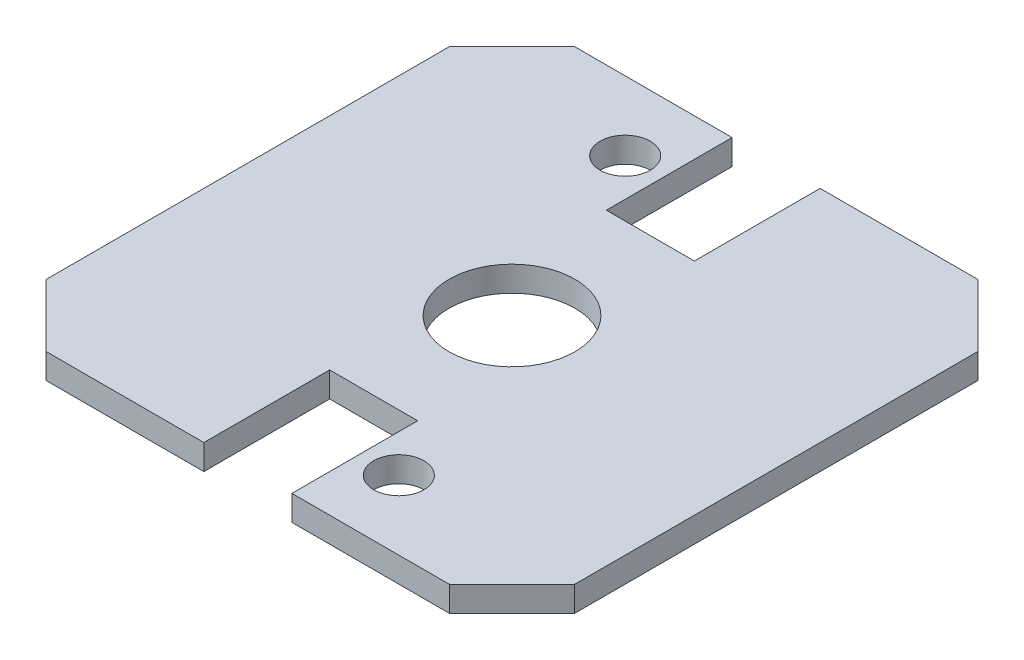
ISO-10303-21;
HEADER;
FILE_DESCRIPTION(('STEP AP214'),'2;1');
FILE_NAME('part.step','',(''),(''),'','','');
FILE_SCHEMA(('AUTOMOTIVE_DESIGN { 1 0 10303 214 1 1 1 1 }'));
ENDSEC;
DATA;
#1=APPLICATION_CONTEXT('core data for automotive mechanical design processes');
#2=APPLICATION_PROTOCOL_DEFINITION('international standard','automotive_design',2000,#1);
#3=PRODUCT_CONTEXT('',#1,'mechanical');
#4=PRODUCT('Part','Part','',(#3));
#5=PRODUCT_RELATED_PRODUCT_CATEGORY('part','',(#4));
#6=PRODUCT_DEFINITION_FORMATION('','',#4);
#7=PRODUCT_DEFINITION_CONTEXT('part definition',#1,'design');
#8=PRODUCT_DEFINITION('design','',#6,#7);
#9=PRODUCT_DEFINITION_SHAPE('','',#8);
#10=(LENGTH_UNIT() NAMED_UNIT(*) SI_UNIT(.MILLI.,.METRE.));
#11=(NAMED_UNIT(*) PLANE_ANGLE_UNIT() SI_UNIT($,.RADIAN.));
#12=(NAMED_UNIT(*) SI_UNIT($,.STERADIAN.) SOLID_ANGLE_UNIT());
#13=UNCERTAINTY_MEASURE_WITH_UNIT(LENGTH_MEASURE(1.E-05),#10,'distance_accuracy_value','');
#14=(GEOMETRIC_REPRESENTATION_CONTEXT(3) GLOBAL_UNCERTAINTY_ASSIGNED_CONTEXT((#13)) GLOBAL_UNIT_ASSIGNED_CONTEXT((#10,
#11,#12)) REPRESENTATION_CONTEXT('',''));
#15=CARTESIAN_POINT('',(0.,0.,0.));
#16=DIRECTION('',(0.,0.,1.));
#17=DIRECTION('',(1.,0.,0.));
#18=AXIS2_PLACEMENT_3D('',#15,#16,#17);
#19=CARTESIAN_POINT('',(-21.,2.,-21.));
#20=DIRECTION('',(0.,0.,1.));
#21=DIRECTION('',(1.,0.,0.));
#22=AXIS2_PLACEMENT_3D('',#19,#20,#21);
#23=PLANE('',#22);
#24=DIRECTION('',(-1.,0.,0.));
#25=VECTOR('',#24,1.);
#26=CARTESIAN_POINT('',(-21.,2.,-21.));
#27=LINE('',#26,#25);
#28=CARTESIAN_POINT('',(-3.5,2.,-21.));
#29=VERTEX_POINT('',#28);
#30=CARTESIAN_POINT('',(-16.0502525316942,2.,-21.));
#31=VERTEX_POINT('',#30);
#32=EDGE_CURVE('E288',#29,#31,#27,.T.);
#33=ORIENTED_EDGE('',*,*,#32,.F.);
#34=DIRECTION('',(0.,-1.,0.));
#35=VECTOR('',#34,1.);
#36=CARTESIAN_POINT('',(-3.5,4.,-21.));
#37=LINE('',#36,#35);
#38=CARTESIAN_POINT('',(-3.5,0.,-21.));
#39=VERTEX_POINT('',#38);
#40=EDGE_CURVE('E233',#29,#39,#37,.T.);
#41=ORIENTED_EDGE('',*,*,#40,.T.);
#42=DIRECTION('',(-1.,0.,0.));
#43=VECTOR('',#42,1.);
#44=CARTESIAN_POINT('',(-21.,0.,-21.));
#45=LINE('',#44,#43);
#46=CARTESIAN_POINT('',(-16.0502525316942,0.,-21.));
#47=VERTEX_POINT('',#46);
#48=EDGE_CURVE('E210',#39,#47,#45,.T.);
#49=ORIENTED_EDGE('',*,*,#48,.T.);
#50=DIRECTION('',(0.,1.,0.));
#51=VECTOR('',#50,1.);
#52=CARTESIAN_POINT('',(-16.0502525316942,-8.,-21.));
#53=LINE('',#52,#51);
#54=EDGE_CURVE('E211',#47,#31,#53,.T.);
#55=ORIENTED_EDGE('',*,*,#54,.T.);
#56=EDGE_LOOP('',(#33,#41,#49,#55));
#57=FACE_BOUND('',#56,.T.);
#58=ADVANCED_FACE('F37',(#57),#23,.F.);
#59=CARTESIAN_POINT('',(-21.,2.,21.));
#60=DIRECTION('',(0.,0.,-1.));
#61=DIRECTION('',(-1.,0.,0.));
#62=AXIS2_PLACEMENT_3D('',#59,#60,#61);
#63=PLANE('',#62);
#64=DIRECTION('',(1.,0.,0.));
#65=VECTOR('',#64,1.);
#66=CARTESIAN_POINT('',(-21.,2.,21.));
#67=LINE('',#66,#65);
#68=CARTESIAN_POINT('',(3.5,2.,21.));
#69=VERTEX_POINT('',#68);
#70=CARTESIAN_POINT('',(16.0502525316942,2.,21.));
#71=VERTEX_POINT('',#70);
#72=EDGE_CURVE('E171',#69,#71,#67,.T.);
#73=ORIENTED_EDGE('',*,*,#72,.F.);
#74=DIRECTION('',(0.,-1.,0.));
#75=VECTOR('',#74,1.);
#76=CARTESIAN_POINT('',(3.5,4.,21.));
#77=LINE('',#76,#75);
#78=CARTESIAN_POINT('',(3.5,0.,21.));
#79=VERTEX_POINT('',#78);
#80=EDGE_CURVE('E154',#69,#79,#77,.T.);
#81=ORIENTED_EDGE('',*,*,#80,.T.);
#82=DIRECTION('',(1.,0.,0.));
#83=VECTOR('',#82,1.);
#84=CARTESIAN_POINT('',(-21.,0.,21.));
#85=LINE('',#84,#83);
#86=CARTESIAN_POINT('',(16.0502525316942,0.,21.));
#87=VERTEX_POINT('',#86);
#88=EDGE_CURVE('E169',#79,#87,#85,.T.);
#89=ORIENTED_EDGE('',*,*,#88,.T.);
#90=DIRECTION('',(0.,1.,0.));
#91=VECTOR('',#90,1.);
#92=CARTESIAN_POINT('',(16.0502525316942,-8.,21.));
#93=LINE('',#92,#91);
#94=EDGE_CURVE('E199',#87,#71,#93,.T.);
#95=ORIENTED_EDGE('',*,*,#94,.T.);
#96=EDGE_LOOP('',(#73,#81,#89,#95));
#97=FACE_BOUND('',#96,.T.);
#98=ADVANCED_FACE('F167',(#97),#63,.F.);
#99=CARTESIAN_POINT('',(21.,2.,21.));
#100=DIRECTION('',(-1.,0.,0.));
#101=DIRECTION('',(0.,0.,1.));
#102=AXIS2_PLACEMENT_3D('',#99,#100,#101);
#103=PLANE('',#102);
#104=DIRECTION('',(0.,0.,-1.));
#105=VECTOR('',#104,1.);
#106=CARTESIAN_POINT('',(21.,2.,21.));
#107=LINE('',#106,#105);
#108=CARTESIAN_POINT('',(21.,2.,16.0502525316942));
#109=VERTEX_POINT('',#108);
#110=CARTESIAN_POINT('',(21.,2.,-16.0502525316942));
#111=VERTEX_POINT('',#110);
#112=EDGE_CURVE('E182',#109,#111,#107,.T.);
#113=ORIENTED_EDGE('',*,*,#112,.F.);
#114=DIRECTION('',(0.,1.,0.));
#115=VECTOR('',#114,1.);
#116=CARTESIAN_POINT('',(21.,-8.,16.0502525316942));
#117=LINE('',#116,#115);
#118=CARTESIAN_POINT('',(21.,0.,16.0502525316942));
#119=VERTEX_POINT('',#118);
#120=EDGE_CURVE('E197',#119,#109,#117,.T.);
#121=ORIENTED_EDGE('',*,*,#120,.F.);
#122=DIRECTION('',(0.,0.,-1.));
#123=VECTOR('',#122,1.);
#124=CARTESIAN_POINT('',(21.,0.,21.));
#125=LINE('',#124,#123);
#126=CARTESIAN_POINT('',(21.,0.,-16.0502525316942));
#127=VERTEX_POINT('',#126);
#128=EDGE_CURVE('E204',#119,#127,#125,.T.);
#129=ORIENTED_EDGE('',*,*,#128,.T.);
#130=DIRECTION('',(0.,1.,0.));
#131=VECTOR('',#130,1.);
#132=CARTESIAN_POINT('',(21.,-8.,-16.0502525316942));
#133=LINE('',#132,#131);
#134=EDGE_CURVE('E271',#127,#111,#133,.T.);
#135=ORIENTED_EDGE('',*,*,#134,.T.);
#136=EDGE_LOOP('',(#113,#121,#129,#135));
#137=FACE_BOUND('',#136,.T.);
#138=ADVANCED_FACE('F39',(#137),#103,.F.);
#139=CARTESIAN_POINT('',(16.0502525316942,0.,-21.));
#140=VERTEX_POINT('',#139);
#141=CARTESIAN_POINT('',(3.49999999999999,0.,-21.));
#142=VERTEX_POINT('',#141);
#143=EDGE_CURVE('E184',#140,#142,#45,.T.);
#144=ORIENTED_EDGE('',*,*,#143,.T.);
#145=DIRECTION('',(0.,-1.,0.));
#146=VECTOR('',#145,1.);
#147=CARTESIAN_POINT('',(3.5,4.,-21.));
#148=LINE('',#147,#146);
#149=CARTESIAN_POINT('',(3.5,2.,-21.));
#150=VERTEX_POINT('',#149);
#151=EDGE_CURVE('E61',#150,#142,#148,.T.);
#152=ORIENTED_EDGE('',*,*,#151,.F.);
#153=CARTESIAN_POINT('',(16.0502525316942,2.,-21.));
#154=VERTEX_POINT('',#153);
#155=EDGE_CURVE('E289',#154,#150,#27,.T.);
#156=ORIENTED_EDGE('',*,*,#155,.F.);
#157=DIRECTION('',(0.,1.,0.));
#158=VECTOR('',#157,1.);
#159=CARTESIAN_POINT('',(16.0502525316942,-8.,-21.));
#160=LINE('',#159,#158);
#161=EDGE_CURVE('E224',#140,#154,#160,.T.);
#162=ORIENTED_EDGE('',*,*,#161,.F.);
#163=EDGE_LOOP('',(#144,#152,#156,#162));
#164=FACE_BOUND('',#163,.T.);
#165=ADVANCED_FACE('F221',(#164),#23,.F.);
#166=CARTESIAN_POINT('',(-21.,2.,21.));
#167=DIRECTION('',(1.,0.,0.));
#168=DIRECTION('',(0.,0.,-1.));
#169=AXIS2_PLACEMENT_3D('',#166,#167,#168);
#170=PLANE('',#169);
#171=DIRECTION('',(0.,0.,1.));
#172=VECTOR('',#171,1.);
#173=CARTESIAN_POINT('',(-21.,0.,21.));
#174=LINE('',#173,#172);
#175=CARTESIAN_POINT('',(-21.,0.,-16.0502525316942));
#176=VERTEX_POINT('',#175);
#177=CARTESIAN_POINT('',(-21.,0.,16.0502525316942));
#178=VERTEX_POINT('',#177);
#179=EDGE_CURVE('E179',#176,#178,#174,.T.);
#180=ORIENTED_EDGE('',*,*,#179,.T.);
#181=DIRECTION('',(0.,1.,0.));
#182=VECTOR('',#181,1.);
#183=CARTESIAN_POINT('',(-21.,-8.,16.0502525316942));
#184=LINE('',#183,#182);
#185=CARTESIAN_POINT('',(-21.,2.,16.0502525316942));
#186=VERTEX_POINT('',#185);
#187=EDGE_CURVE('E276',#178,#186,#184,.T.);
#188=ORIENTED_EDGE('',*,*,#187,.T.);
#189=DIRECTION('',(0.,0.,1.));
#190=VECTOR('',#189,1.);
#191=CARTESIAN_POINT('',(-21.,2.,21.));
#192=LINE('',#191,#190);
#193=CARTESIAN_POINT('',(-21.,2.,-16.0502525316942));
#194=VERTEX_POINT('',#193);
#195=EDGE_CURVE('E290',#194,#186,#192,.T.);
#196=ORIENTED_EDGE('',*,*,#195,.F.);
#197=DIRECTION('',(0.,1.,0.));
#198=VECTOR('',#197,1.);
#199=CARTESIAN_POINT('',(-21.,-8.,-16.0502525316942));
#200=LINE('',#199,#198);
#201=EDGE_CURVE('E214',#176,#194,#200,.T.);
#202=ORIENTED_EDGE('',*,*,#201,.F.);
#203=EDGE_LOOP('',(#180,#188,#196,#202));
#204=FACE_BOUND('',#203,.T.);
#205=ADVANCED_FACE('F328',(#204),#170,.F.);
#206=CARTESIAN_POINT('',(-16.0502525316942,0.,21.));
#207=VERTEX_POINT('',#206);
#208=CARTESIAN_POINT('',(-3.50000000000001,0.,21.));
#209=VERTEX_POINT('',#208);
#210=EDGE_CURVE('E178',#207,#209,#85,.T.);
#211=ORIENTED_EDGE('',*,*,#210,.T.);
#212=DIRECTION('',(0.,-1.,0.));
#213=VECTOR('',#212,1.);
#214=CARTESIAN_POINT('',(-3.5,4.,21.));
#215=LINE('',#214,#213);
#216=CARTESIAN_POINT('',(-3.5,2.,21.));
#217=VERTEX_POINT('',#216);
#218=EDGE_CURVE('E53',#217,#209,#215,.T.);
#219=ORIENTED_EDGE('',*,*,#218,.F.);
#220=CARTESIAN_POINT('',(-16.0502525316942,2.,21.));
#221=VERTEX_POINT('',#220);
#222=EDGE_CURVE('E191',#221,#217,#67,.T.);
#223=ORIENTED_EDGE('',*,*,#222,.F.);
#224=DIRECTION('',(0.,1.,0.));
#225=VECTOR('',#224,1.);
#226=CARTESIAN_POINT('',(-16.0502525316942,-8.,21.));
#227=LINE('',#226,#225);
#228=EDGE_CURVE('E280',#207,#221,#227,.T.);
#229=ORIENTED_EDGE('',*,*,#228,.F.);
#230=EDGE_LOOP('',(#211,#219,#223,#229));
#231=FACE_BOUND('',#230,.T.);
#232=ADVANCED_FACE('F301',(#231),#63,.F.);
#233=CARTESIAN_POINT('',(0.,2.,0.));
#234=DIRECTION('',(0.,-1.,0.));
#235=DIRECTION('',(0.,0.,-1.));
#236=AXIS2_PLACEMENT_3D('',#233,#234,#235);
#237=PLANE('',#236);
#238=CARTESIAN_POINT('',(6.5,2.,15.5));
#239=DIRECTION('',(0.,-1.,0.));
#240=DIRECTION('',(0.,0.,-1.));
#241=AXIS2_PLACEMENT_3D('',#238,#239,#240);
#242=CIRCLE('',#241,2.);
#243=CARTESIAN_POINT('',(6.5,2.,13.5));
#244=VERTEX_POINT('',#243);
#245=EDGE_CURVE('E263',#244,#244,#242,.T.);
#246=ORIENTED_EDGE('',*,*,#245,.T.);
#247=EDGE_LOOP('',(#246));
#248=FACE_BOUND('',#247,.T.);
#249=CARTESIAN_POINT('',(-6.5,2.,-15.5));
#250=DIRECTION('',(0.,-1.,0.));
#251=DIRECTION('',(0.,0.,-1.));
#252=AXIS2_PLACEMENT_3D('',#249,#250,#251);
#253=CIRCLE('',#252,2.);
#254=CARTESIAN_POINT('',(-6.5,2.,-17.5));
#255=VERTEX_POINT('',#254);
#256=EDGE_CURVE('E258',#255,#255,#253,.T.);
#257=ORIENTED_EDGE('',*,*,#256,.T.);
#258=EDGE_LOOP('',(#257));
#259=FACE_BOUND('',#258,.T.);
#260=CARTESIAN_POINT('',(0.,2.,0.));
#261=DIRECTION('',(0.,1.,0.));
#262=DIRECTION('',(0.,0.,1.));
#263=AXIS2_PLACEMENT_3D('',#260,#261,#262);
#264=CIRCLE('',#263,5.);
#265=CARTESIAN_POINT('',(0.,2.,5.));
#266=VERTEX_POINT('',#265);
#267=EDGE_CURVE('E266',#266,#266,#264,.T.);
#268=ORIENTED_EDGE('',*,*,#267,.F.);
#269=EDGE_LOOP('',(#268));
#270=FACE_BOUND('',#269,.T.);
#271=DIRECTION('',(1.,0.,0.));
#272=VECTOR('',#271,1.);
#273=CARTESIAN_POINT('',(0.,2.,11.));
#274=LINE('',#273,#272);
#275=CARTESIAN_POINT('',(-3.5,2.,11.));
#276=VERTEX_POINT('',#275);
#277=CARTESIAN_POINT('',(3.5,2.,11.));
#278=VERTEX_POINT('',#277);
#279=EDGE_CURVE('E249',#276,#278,#274,.T.);
#280=ORIENTED_EDGE('',*,*,#279,.T.);
#281=DIRECTION('',(0.,0.,1.));
#282=VECTOR('',#281,1.);
#283=CARTESIAN_POINT('',(3.5,2.,0.));
#284=LINE('',#283,#282);
#285=EDGE_CURVE('E252',#278,#69,#284,.T.);
#286=ORIENTED_EDGE('',*,*,#285,.T.);
#287=ORIENTED_EDGE('',*,*,#72,.T.);
#288=DIRECTION('',(-0.707106781186546,0.,0.707106781186549));
#289=VECTOR('',#288,1.);
#290=CARTESIAN_POINT('',(18.5251262658471,2.,18.525126265847));
#291=LINE('',#290,#289);
#292=EDGE_CURVE('E206',#109,#71,#291,.T.);
#293=ORIENTED_EDGE('',*,*,#292,.F.);
#294=ORIENTED_EDGE('',*,*,#112,.T.);
#295=DIRECTION('',(0.707106781186549,0.,0.707106781186546));
#296=VECTOR('',#295,1.);
#297=CARTESIAN_POINT('',(18.5251262658471,2.,-18.5251262658471));
#298=LINE('',#297,#296);
#299=EDGE_CURVE('E269',#154,#111,#298,.T.);
#300=ORIENTED_EDGE('',*,*,#299,.F.);
#301=ORIENTED_EDGE('',*,*,#155,.T.);
#302=DIRECTION('',(0.,0.,1.));
#303=VECTOR('',#302,1.);
#304=CARTESIAN_POINT('',(3.5,2.,0.));
#305=LINE('',#304,#303);
#306=CARTESIAN_POINT('',(3.5,2.,-11.));
#307=VERTEX_POINT('',#306);
#308=EDGE_CURVE('E237',#150,#307,#305,.T.);
#309=ORIENTED_EDGE('',*,*,#308,.T.);
#310=DIRECTION('',(-1.,0.,0.));
#311=VECTOR('',#310,1.);
#312=CARTESIAN_POINT('',(0.,2.,-11.));
#313=LINE('',#312,#311);
#314=CARTESIAN_POINT('',(-3.5,2.,-11.));
#315=VERTEX_POINT('',#314);
#316=EDGE_CURVE('E240',#307,#315,#313,.T.);
#317=ORIENTED_EDGE('',*,*,#316,.T.);
#318=DIRECTION('',(0.,0.,-1.));
#319=VECTOR('',#318,1.);
#320=CARTESIAN_POINT('',(-3.5,2.,0.));
#321=LINE('',#320,#319);
#322=EDGE_CURVE('E243',#315,#29,#321,.T.);
#323=ORIENTED_EDGE('',*,*,#322,.T.);
#324=ORIENTED_EDGE('',*,*,#32,.T.);
#325=DIRECTION('',(0.707106781186546,0.,-0.707106781186549));
#326=VECTOR('',#325,1.);
#327=CARTESIAN_POINT('',(-18.5251262658471,2.,-18.525126265847));
#328=LINE('',#327,#326);
#329=EDGE_CURVE('E273',#194,#31,#328,.T.);
#330=ORIENTED_EDGE('',*,*,#329,.F.);
#331=ORIENTED_EDGE('',*,*,#195,.T.);
#332=DIRECTION('',(-0.707106781186548,0.,-0.707106781186547));
#333=VECTOR('',#332,1.);
#334=CARTESIAN_POINT('',(-18.5251262658471,2.,18.5251262658471));
#335=LINE('',#334,#333);
#336=EDGE_CURVE('E278',#221,#186,#335,.T.);
#337=ORIENTED_EDGE('',*,*,#336,.F.);
#338=ORIENTED_EDGE('',*,*,#222,.T.);
#339=DIRECTION('',(0.,0.,-1.));
#340=VECTOR('',#339,1.);
#341=CARTESIAN_POINT('',(-3.5,2.,0.));
#342=LINE('',#341,#340);
#343=EDGE_CURVE('E246',#217,#276,#342,.T.);
#344=ORIENTED_EDGE('',*,*,#343,.T.);
#345=EDGE_LOOP('',(#280,#286,#287,#293,#294,#300,#301,#309,#317,#323,#324,#330,#331,#337,#338,#344));
#346=FACE_BOUND('',#345,.T.);
#347=ADVANCED_FACE('F298',(#248,#259,#270,#346),#237,.F.);
#348=CARTESIAN_POINT('',(0.,0.,0.));
#349=DIRECTION('',(0.,-1.,0.));
#350=DIRECTION('',(0.,0.,-1.));
#351=AXIS2_PLACEMENT_3D('',#348,#349,#350);
#352=PLANE('',#351);
#353=DIRECTION('',(0.,0.,1.));
#354=VECTOR('',#353,1.);
#355=CARTESIAN_POINT('',(3.5,0.,11.));
#356=LINE('',#355,#354);
#357=CARTESIAN_POINT('',(3.5,0.,11.));
#358=VERTEX_POINT('',#357);
#359=EDGE_CURVE('E151',#358,#79,#356,.T.);
#360=ORIENTED_EDGE('',*,*,#359,.F.);
#361=DIRECTION('',(1.,0.,0.));
#362=VECTOR('',#361,1.);
#363=CARTESIAN_POINT('',(-3.5,0.,11.));
#364=LINE('',#363,#362);
#365=CARTESIAN_POINT('',(-3.5,0.,11.));
#366=VERTEX_POINT('',#365);
#367=EDGE_CURVE('E172',#366,#358,#364,.T.);
#368=ORIENTED_EDGE('',*,*,#367,.F.);
#369=DIRECTION('',(0.,0.,-1.));
#370=VECTOR('',#369,1.);
#371=CARTESIAN_POINT('',(-3.5,0.,11.));
#372=LINE('',#371,#370);
#373=EDGE_CURVE('E162',#209,#366,#372,.T.);
#374=ORIENTED_EDGE('',*,*,#373,.F.);
#375=ORIENTED_EDGE('',*,*,#210,.F.);
#376=DIRECTION('',(0.707106781186548,0.,0.707106781186547));
#377=VECTOR('',#376,1.);
#378=CARTESIAN_POINT('',(-18.5251262658471,0.,18.5251262658471));
#379=LINE('',#378,#377);
#380=EDGE_CURVE('E11',#178,#207,#379,.T.);
#381=ORIENTED_EDGE('',*,*,#380,.F.);
#382=ORIENTED_EDGE('',*,*,#179,.F.);
#383=DIRECTION('',(-0.707106781186546,0.,0.707106781186549));
#384=VECTOR('',#383,1.);
#385=CARTESIAN_POINT('',(-18.5251262658471,0.,-18.525126265847));
#386=LINE('',#385,#384);
#387=EDGE_CURVE('E188',#47,#176,#386,.T.);
#388=ORIENTED_EDGE('',*,*,#387,.F.);
#389=ORIENTED_EDGE('',*,*,#48,.F.);
#390=DIRECTION('',(0.,0.,-1.));
#391=VECTOR('',#390,1.);
#392=CARTESIAN_POINT('',(-3.5,0.,-21.));
#393=LINE('',#392,#391);
#394=CARTESIAN_POINT('',(-3.5,0.,-11.));
#395=VERTEX_POINT('',#394);
#396=EDGE_CURVE('E163',#395,#39,#393,.T.);
#397=ORIENTED_EDGE('',*,*,#396,.F.);
#398=DIRECTION('',(-1.,0.,0.));
#399=VECTOR('',#398,1.);
#400=CARTESIAN_POINT('',(-3.5,0.,-11.));
#401=LINE('',#400,#399);
#402=CARTESIAN_POINT('',(3.5,0.,-11.));
#403=VERTEX_POINT('',#402);
#404=EDGE_CURVE('E229',#403,#395,#401,.T.);
#405=ORIENTED_EDGE('',*,*,#404,.F.);
#406=DIRECTION('',(0.,0.,1.));
#407=VECTOR('',#406,1.);
#408=CARTESIAN_POINT('',(3.5,0.,-21.));
#409=LINE('',#408,#407);
#410=EDGE_CURVE('E226',#142,#403,#409,.T.);
#411=ORIENTED_EDGE('',*,*,#410,.F.);
#412=ORIENTED_EDGE('',*,*,#143,.F.);
#413=DIRECTION('',(-0.707106781186549,0.,-0.707106781186546));
#414=VECTOR('',#413,1.);
#415=CARTESIAN_POINT('',(18.5251262658471,0.,-18.5251262658471));
#416=LINE('',#415,#414);
#417=EDGE_CURVE('E190',#127,#140,#416,.T.);
#418=ORIENTED_EDGE('',*,*,#417,.F.);
#419=ORIENTED_EDGE('',*,*,#128,.F.);
#420=DIRECTION('',(0.707106781186546,0.,-0.707106781186549));
#421=VECTOR('',#420,1.);
#422=CARTESIAN_POINT('',(18.5251262658471,0.,18.525126265847));
#423=LINE('',#422,#421);
#424=EDGE_CURVE('E46',#87,#119,#423,.T.);
#425=ORIENTED_EDGE('',*,*,#424,.F.);
#426=ORIENTED_EDGE('',*,*,#88,.F.);
#427=EDGE_LOOP('',(#360,#368,#374,#375,#381,#382,#388,#389,#397,#405,#411,#412,#418,#419,#425,#426));
#428=FACE_BOUND('',#427,.T.);
#429=CARTESIAN_POINT('',(6.5,0.,15.5));
#430=DIRECTION('',(0.,-1.,0.));
#431=DIRECTION('',(0.,0.,-1.));
#432=AXIS2_PLACEMENT_3D('',#429,#430,#431);
#433=CIRCLE('',#432,2.);
#434=CARTESIAN_POINT('',(6.5,0.,13.5));
#435=VERTEX_POINT('',#434);
#436=EDGE_CURVE('E255',#435,#435,#433,.T.);
#437=ORIENTED_EDGE('',*,*,#436,.F.);
#438=EDGE_LOOP('',(#437));
#439=FACE_BOUND('',#438,.T.);
#440=CARTESIAN_POINT('',(-6.5,0.,-15.5));
#441=DIRECTION('',(0.,-1.,0.));
#442=DIRECTION('',(0.,0.,-1.));
#443=AXIS2_PLACEMENT_3D('',#440,#441,#442);
#444=CIRCLE('',#443,2.);
#445=CARTESIAN_POINT('',(-6.5,0.,-17.5));
#446=VERTEX_POINT('',#445);
#447=EDGE_CURVE('E254',#446,#446,#444,.T.);
#448=ORIENTED_EDGE('',*,*,#447,.F.);
#449=EDGE_LOOP('',(#448));
#450=FACE_BOUND('',#449,.T.);
#451=CARTESIAN_POINT('',(0.,0.,0.));
#452=DIRECTION('',(0.,-1.,0.));
#453=DIRECTION('',(0.,0.,-1.));
#454=AXIS2_PLACEMENT_3D('',#451,#452,#453);
#455=CIRCLE('',#454,5.);
#456=CARTESIAN_POINT('',(0.,0.,-5.));
#457=VERTEX_POINT('',#456);
#458=EDGE_CURVE('E41',#457,#457,#455,.T.);
#459=ORIENTED_EDGE('',*,*,#458,.F.);
#460=EDGE_LOOP('',(#459));
#461=FACE_BOUND('',#460,.T.);
#462=ADVANCED_FACE('F175',(#428,#439,#450,#461),#352,.T.);
#463=CARTESIAN_POINT('',(-18.5251262658471,-8.,-18.525126265847));
#464=DIRECTION('',(0.707106781186549,0.,0.707106781186546));
#465=DIRECTION('',(0.707106781186546,0.,-0.707106781186549));
#466=AXIS2_PLACEMENT_3D('',#463,#464,#465);
#467=PLANE('',#466);
#468=ORIENTED_EDGE('',*,*,#387,.T.);
#469=ORIENTED_EDGE('',*,*,#201,.T.);
#470=ORIENTED_EDGE('',*,*,#329,.T.);
#471=ORIENTED_EDGE('',*,*,#54,.F.);
#472=EDGE_LOOP('',(#468,#469,#470,#471));
#473=FACE_BOUND('',#472,.T.);
#474=ADVANCED_FACE('F325',(#473),#467,.F.);
#475=CARTESIAN_POINT('',(18.5251262658471,-8.,-18.5251262658471));
#476=DIRECTION('',(-0.707106781186546,0.,0.707106781186549));
#477=DIRECTION('',(0.707106781186549,0.,0.707106781186546));
#478=AXIS2_PLACEMENT_3D('',#475,#476,#477);
#479=PLANE('',#478);
#480=ORIENTED_EDGE('',*,*,#417,.T.);
#481=ORIENTED_EDGE('',*,*,#161,.T.);
#482=ORIENTED_EDGE('',*,*,#299,.T.);
#483=ORIENTED_EDGE('',*,*,#134,.F.);
#484=EDGE_LOOP('',(#480,#481,#482,#483));
#485=FACE_BOUND('',#484,.T.);
#486=ADVANCED_FACE('F372',(#485),#479,.F.);
#487=CARTESIAN_POINT('',(18.5251262658471,-8.,18.525126265847));
#488=DIRECTION('',(-0.707106781186549,0.,-0.707106781186546));
#489=DIRECTION('',(-0.707106781186546,0.,0.707106781186549));
#490=AXIS2_PLACEMENT_3D('',#487,#488,#489);
#491=PLANE('',#490);
#492=ORIENTED_EDGE('',*,*,#424,.T.);
#493=ORIENTED_EDGE('',*,*,#120,.T.);
#494=ORIENTED_EDGE('',*,*,#292,.T.);
#495=ORIENTED_EDGE('',*,*,#94,.F.);
#496=EDGE_LOOP('',(#492,#493,#494,#495));
#497=FACE_BOUND('',#496,.T.);
#498=ADVANCED_FACE('F195',(#497),#491,.F.);
#499=CARTESIAN_POINT('',(-18.5251262658471,-8.,18.5251262658471));
#500=DIRECTION('',(0.707106781186547,0.,-0.707106781186548));
#501=DIRECTION('',(-0.707106781186548,0.,-0.707106781186547));
#502=AXIS2_PLACEMENT_3D('',#499,#500,#501);
#503=PLANE('',#502);
#504=ORIENTED_EDGE('',*,*,#380,.T.);
#505=ORIENTED_EDGE('',*,*,#228,.T.);
#506=ORIENTED_EDGE('',*,*,#336,.T.);
#507=ORIENTED_EDGE('',*,*,#187,.F.);
#508=EDGE_LOOP('',(#504,#505,#506,#507));
#509=FACE_BOUND('',#508,.T.);
#510=ADVANCED_FACE('F331',(#509),#503,.F.);
#511=CARTESIAN_POINT('',(0.,-8.,0.));
#512=DIRECTION('',(0.,1.,0.));
#513=DIRECTION('',(0.,0.,1.));
#514=AXIS2_PLACEMENT_3D('',#511,#512,#513);
#515=CYLINDRICAL_SURFACE('',#514,5.);
#516=ORIENTED_EDGE('',*,*,#458,.T.);
#517=EDGE_LOOP('',(#516));
#518=FACE_BOUND('',#517,.T.);
#519=ORIENTED_EDGE('',*,*,#267,.T.);
#520=EDGE_LOOP('',(#519));
#521=FACE_BOUND('',#520,.T.);
#522=ADVANCED_FACE('F403',(#518,#521),#515,.F.);
#523=CARTESIAN_POINT('',(-6.5,10.,-15.5));
#524=DIRECTION('',(0.,-1.,0.));
#525=DIRECTION('',(0.,0.,-1.));
#526=AXIS2_PLACEMENT_3D('',#523,#524,#525);
#527=CYLINDRICAL_SURFACE('',#526,2.);
#528=ORIENTED_EDGE('',*,*,#447,.T.);
#529=EDGE_LOOP('',(#528));
#530=FACE_BOUND('',#529,.T.);
#531=ORIENTED_EDGE('',*,*,#256,.F.);
#532=EDGE_LOOP('',(#531));
#533=FACE_BOUND('',#532,.T.);
#534=ADVANCED_FACE('F413',(#530,#533),#527,.F.);
#535=CARTESIAN_POINT('',(6.5,10.,15.5));
#536=DIRECTION('',(0.,-1.,0.));
#537=DIRECTION('',(0.,0.,-1.));
#538=AXIS2_PLACEMENT_3D('',#535,#536,#537);
#539=CYLINDRICAL_SURFACE('',#538,2.);
#540=ORIENTED_EDGE('',*,*,#436,.T.);
#541=EDGE_LOOP('',(#540));
#542=FACE_BOUND('',#541,.T.);
#543=ORIENTED_EDGE('',*,*,#245,.F.);
#544=EDGE_LOOP('',(#543));
#545=FACE_BOUND('',#544,.T.);
#546=ADVANCED_FACE('F423',(#542,#545),#539,.F.);
#547=CARTESIAN_POINT('',(-3.5,4.,-21.));
#548=DIRECTION('',(-1.,0.,0.));
#549=DIRECTION('',(0.,0.,1.));
#550=AXIS2_PLACEMENT_3D('',#547,#548,#549);
#551=PLANE('',#550);
#552=DIRECTION('',(0.,-1.,0.));
#553=VECTOR('',#552,1.);
#554=CARTESIAN_POINT('',(-3.5,4.,-11.));
#555=LINE('',#554,#553);
#556=EDGE_CURVE('E312',#315,#395,#555,.T.);
#557=ORIENTED_EDGE('',*,*,#556,.T.);
#558=ORIENTED_EDGE('',*,*,#396,.T.);
#559=ORIENTED_EDGE('',*,*,#40,.F.);
#560=ORIENTED_EDGE('',*,*,#322,.F.);
#561=EDGE_LOOP('',(#557,#558,#559,#560));
#562=FACE_BOUND('',#561,.T.);
#563=ADVANCED_FACE('F315',(#562),#551,.F.);
#564=CARTESIAN_POINT('',(-3.5,4.,-11.));
#565=DIRECTION('',(0.,0.,1.));
#566=DIRECTION('',(1.,0.,0.));
#567=AXIS2_PLACEMENT_3D('',#564,#565,#566);
#568=PLANE('',#567);
#569=DIRECTION('',(0.,-1.,0.));
#570=VECTOR('',#569,1.);
#571=CARTESIAN_POINT('',(3.5,4.,-11.));
#572=LINE('',#571,#570);
#573=EDGE_CURVE('E311',#307,#403,#572,.T.);
#574=ORIENTED_EDGE('',*,*,#573,.T.);
#575=ORIENTED_EDGE('',*,*,#404,.T.);
#576=ORIENTED_EDGE('',*,*,#556,.F.);
#577=ORIENTED_EDGE('',*,*,#316,.F.);
#578=EDGE_LOOP('',(#574,#575,#576,#577));
#579=FACE_BOUND('',#578,.T.);
#580=ADVANCED_FACE('F317',(#579),#568,.F.);
#581=CARTESIAN_POINT('',(3.5,4.,-21.));
#582=DIRECTION('',(1.,0.,0.));
#583=DIRECTION('',(0.,0.,-1.));
#584=AXIS2_PLACEMENT_3D('',#581,#582,#583);
#585=PLANE('',#584);
#586=ORIENTED_EDGE('',*,*,#151,.T.);
#587=ORIENTED_EDGE('',*,*,#410,.T.);
#588=ORIENTED_EDGE('',*,*,#573,.F.);
#589=ORIENTED_EDGE('',*,*,#308,.F.);
#590=EDGE_LOOP('',(#586,#587,#588,#589));
#591=FACE_BOUND('',#590,.T.);
#592=ADVANCED_FACE('F461',(#591),#585,.F.);
#593=CARTESIAN_POINT('',(3.5,4.,11.));
#594=DIRECTION('',(1.,0.,0.));
#595=DIRECTION('',(0.,0.,-1.));
#596=AXIS2_PLACEMENT_3D('',#593,#594,#595);
#597=PLANE('',#596);
#598=DIRECTION('',(0.,-1.,0.));
#599=VECTOR('',#598,1.);
#600=CARTESIAN_POINT('',(3.5,4.,11.));
#601=LINE('',#600,#599);
#602=EDGE_CURVE('E157',#278,#358,#601,.T.);
#603=ORIENTED_EDGE('',*,*,#602,.T.);
#604=ORIENTED_EDGE('',*,*,#359,.T.);
#605=ORIENTED_EDGE('',*,*,#80,.F.);
#606=ORIENTED_EDGE('',*,*,#285,.F.);
#607=EDGE_LOOP('',(#603,#604,#605,#606));
#608=FACE_BOUND('',#607,.T.);
#609=ADVANCED_FACE('F153',(#608),#597,.F.);
#610=CARTESIAN_POINT('',(-3.5,4.,11.));
#611=DIRECTION('',(0.,0.,-1.));
#612=DIRECTION('',(-1.,0.,0.));
#613=AXIS2_PLACEMENT_3D('',#610,#611,#612);
#614=PLANE('',#613);
#615=DIRECTION('',(0.,-1.,0.));
#616=VECTOR('',#615,1.);
#617=CARTESIAN_POINT('',(-3.5,4.,11.));
#618=LINE('',#617,#616);
#619=EDGE_CURVE('E303',#276,#366,#618,.T.);
#620=ORIENTED_EDGE('',*,*,#619,.T.);
#621=ORIENTED_EDGE('',*,*,#367,.T.);
#622=ORIENTED_EDGE('',*,*,#602,.F.);
#623=ORIENTED_EDGE('',*,*,#279,.F.);
#624=EDGE_LOOP('',(#620,#621,#622,#623));
#625=FACE_BOUND('',#624,.T.);
#626=ADVANCED_FACE('F336',(#625),#614,.F.);
#627=CARTESIAN_POINT('',(-3.5,4.,11.));
#628=DIRECTION('',(-1.,0.,0.));
#629=DIRECTION('',(0.,0.,1.));
#630=AXIS2_PLACEMENT_3D('',#627,#628,#629);
#631=PLANE('',#630);
#632=ORIENTED_EDGE('',*,*,#218,.T.);
#633=ORIENTED_EDGE('',*,*,#373,.T.);
#634=ORIENTED_EDGE('',*,*,#619,.F.);
#635=ORIENTED_EDGE('',*,*,#343,.F.);
#636=EDGE_LOOP('',(#632,#633,#634,#635));
#637=FACE_BOUND('',#636,.T.);
#638=ADVANCED_FACE('F337',(#637),#631,.F.);
#639=CLOSED_SHELL('',(#58,#98,#138,#165,#205,#232,#347,#462,#474,#486,#498,#510,#522,#534,#546,
#563,#580,#592,#609,#626,#638));
#640=MANIFOLD_SOLID_BREP('B2',#639);
#641=ADVANCED_BREP_SHAPE_REPRESENTATION('',(#18,#640),#14);
#642=SHAPE_DEFINITION_REPRESENTATION(#9,#641);
ENDSEC;
END-ISO-10303-21;
